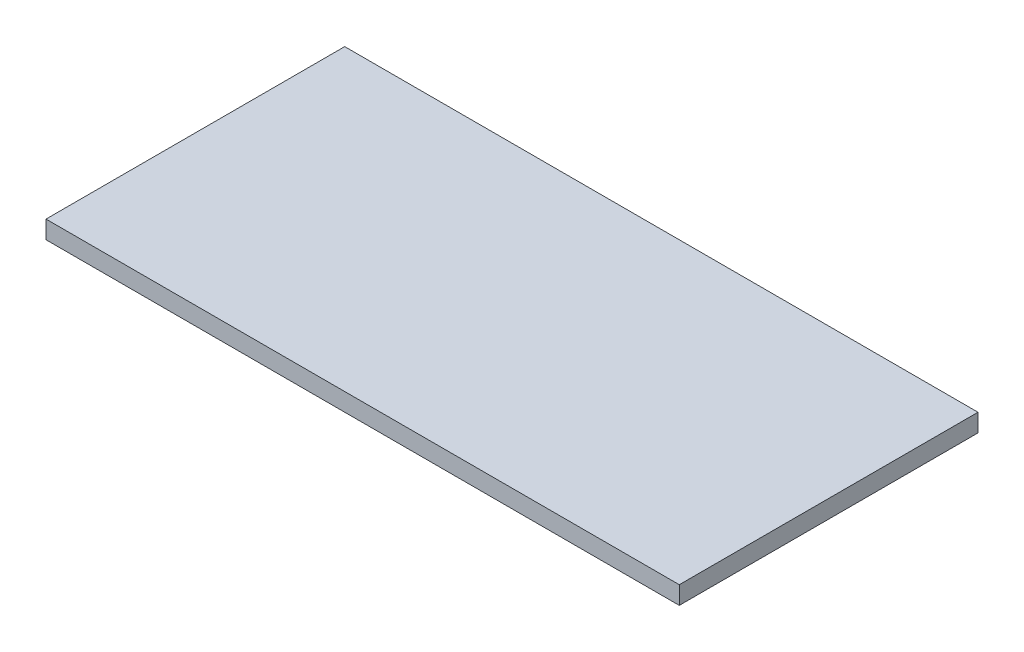
ISO-10303-21;
HEADER;
FILE_DESCRIPTION(('STEP AP214'),'2;1');
FILE_NAME('part.step','',(''),(''),'','','');
FILE_SCHEMA(('AUTOMOTIVE_DESIGN { 1 0 10303 214 1 1 1 1 }'));
ENDSEC;
DATA;
#1=APPLICATION_CONTEXT('core data for automotive mechanical design processes');
#2=APPLICATION_PROTOCOL_DEFINITION('international standard','automotive_design',2000,#1);
#3=PRODUCT_CONTEXT('',#1,'mechanical');
#4=PRODUCT('Part','Part','',(#3));
#5=PRODUCT_RELATED_PRODUCT_CATEGORY('part','',(#4));
#6=PRODUCT_DEFINITION_FORMATION('','',#4);
#7=PRODUCT_DEFINITION_CONTEXT('part definition',#1,'design');
#8=PRODUCT_DEFINITION('design','',#6,#7);
#9=PRODUCT_DEFINITION_SHAPE('','',#8);
#10=(LENGTH_UNIT() NAMED_UNIT(*) SI_UNIT(.MILLI.,.METRE.));
#11=(NAMED_UNIT(*) PLANE_ANGLE_UNIT() SI_UNIT($,.RADIAN.));
#12=(NAMED_UNIT(*) SI_UNIT($,.STERADIAN.) SOLID_ANGLE_UNIT());
#13=UNCERTAINTY_MEASURE_WITH_UNIT(LENGTH_MEASURE(1.E-05),#10,'distance_accuracy_value','');
#14=(GEOMETRIC_REPRESENTATION_CONTEXT(3) GLOBAL_UNCERTAINTY_ASSIGNED_CONTEXT((#13)) GLOBAL_UNIT_ASSIGNED_CONTEXT((#10,
#11,#12)) REPRESENTATION_CONTEXT('',''));
#15=CARTESIAN_POINT('',(0.,0.,0.));
#16=DIRECTION('',(0.,0.,1.));
#17=DIRECTION('',(1.,0.,0.));
#18=AXIS2_PLACEMENT_3D('',#15,#16,#17);
#19=CARTESIAN_POINT('',(0.,6.,0.));
#20=DIRECTION('',(1.,0.,0.));
#21=DIRECTION('',(0.,0.,-1.));
#22=AXIS2_PLACEMENT_3D('',#19,#20,#21);
#23=PLANE('',#22);
#24=DIRECTION('',(0.,0.,1.));
#25=VECTOR('',#24,1.);
#26=CARTESIAN_POINT('',(0.,0.,0.));
#27=LINE('',#26,#25);
#28=CARTESIAN_POINT('',(0.,0.,-100.));
#29=VERTEX_POINT('',#28);
#30=CARTESIAN_POINT('',(0.,0.,0.));
#31=VERTEX_POINT('',#30);
#32=EDGE_CURVE('E96',#29,#31,#27,.T.);
#33=ORIENTED_EDGE('',*,*,#32,.T.);
#34=DIRECTION('',(0.,-1.,0.));
#35=VECTOR('',#34,1.);
#36=CARTESIAN_POINT('',(0.,6.,0.));
#37=LINE('',#36,#35);
#38=CARTESIAN_POINT('',(0.,6.,0.));
#39=VERTEX_POINT('',#38);
#40=EDGE_CURVE('E11',#39,#31,#37,.T.);
#41=ORIENTED_EDGE('',*,*,#40,.F.);
#42=DIRECTION('',(0.,0.,1.));
#43=VECTOR('',#42,1.);
#44=CARTESIAN_POINT('',(0.,6.,0.));
#45=LINE('',#44,#43);
#46=CARTESIAN_POINT('',(0.,6.,-100.));
#47=VERTEX_POINT('',#46);
#48=EDGE_CURVE('E84',#47,#39,#45,.T.);
#49=ORIENTED_EDGE('',*,*,#48,.F.);
#50=DIRECTION('',(0.,-1.,0.));
#51=VECTOR('',#50,1.);
#52=CARTESIAN_POINT('',(0.,6.,-100.));
#53=LINE('',#52,#51);
#54=EDGE_CURVE('E92',#47,#29,#53,.T.);
#55=ORIENTED_EDGE('',*,*,#54,.T.);
#56=EDGE_LOOP('',(#33,#41,#49,#55));
#57=FACE_BOUND('',#56,.T.);
#58=ADVANCED_FACE('F33',(#57),#23,.F.);
#59=CARTESIAN_POINT('',(0.,6.,0.));
#60=DIRECTION('',(0.,0.,-1.));
#61=DIRECTION('',(-1.,0.,0.));
#62=AXIS2_PLACEMENT_3D('',#59,#60,#61);
#63=PLANE('',#62);
#64=DIRECTION('',(1.,0.,0.));
#65=VECTOR('',#64,1.);
#66=CARTESIAN_POINT('',(0.,0.,0.));
#67=LINE('',#66,#65);
#68=CARTESIAN_POINT('',(212.,0.,0.));
#69=VERTEX_POINT('',#68);
#70=EDGE_CURVE('E88',#31,#69,#67,.T.);
#71=ORIENTED_EDGE('',*,*,#70,.T.);
#72=DIRECTION('',(0.,-1.,0.));
#73=VECTOR('',#72,1.);
#74=CARTESIAN_POINT('',(212.,6.,0.));
#75=LINE('',#74,#73);
#76=CARTESIAN_POINT('',(212.,6.,0.));
#77=VERTEX_POINT('',#76);
#78=EDGE_CURVE('E41',#77,#69,#75,.T.);
#79=ORIENTED_EDGE('',*,*,#78,.F.);
#80=DIRECTION('',(1.,0.,0.));
#81=VECTOR('',#80,1.);
#82=CARTESIAN_POINT('',(0.,6.,0.));
#83=LINE('',#82,#81);
#84=EDGE_CURVE('E79',#39,#77,#83,.T.);
#85=ORIENTED_EDGE('',*,*,#84,.F.);
#86=ORIENTED_EDGE('',*,*,#40,.T.);
#87=EDGE_LOOP('',(#71,#79,#85,#86));
#88=FACE_BOUND('',#87,.T.);
#89=ADVANCED_FACE('F87',(#88),#63,.F.);
#90=CARTESIAN_POINT('',(212.,6.,0.));
#91=DIRECTION('',(-1.,0.,0.));
#92=DIRECTION('',(0.,0.,1.));
#93=AXIS2_PLACEMENT_3D('',#90,#91,#92);
#94=PLANE('',#93);
#95=DIRECTION('',(0.,0.,-1.));
#96=VECTOR('',#95,1.);
#97=CARTESIAN_POINT('',(212.,0.,0.));
#98=LINE('',#97,#96);
#99=CARTESIAN_POINT('',(212.,0.,-100.));
#100=VERTEX_POINT('',#99);
#101=EDGE_CURVE('E66',#69,#100,#98,.T.);
#102=ORIENTED_EDGE('',*,*,#101,.T.);
#103=DIRECTION('',(0.,-1.,0.));
#104=VECTOR('',#103,1.);
#105=CARTESIAN_POINT('',(212.,6.,-100.));
#106=LINE('',#105,#104);
#107=CARTESIAN_POINT('',(212.,6.,-100.));
#108=VERTEX_POINT('',#107);
#109=EDGE_CURVE('E89',#108,#100,#106,.T.);
#110=ORIENTED_EDGE('',*,*,#109,.F.);
#111=DIRECTION('',(0.,0.,-1.));
#112=VECTOR('',#111,1.);
#113=CARTESIAN_POINT('',(212.,6.,0.));
#114=LINE('',#113,#112);
#115=EDGE_CURVE('E82',#77,#108,#114,.T.);
#116=ORIENTED_EDGE('',*,*,#115,.F.);
#117=ORIENTED_EDGE('',*,*,#78,.T.);
#118=EDGE_LOOP('',(#102,#110,#116,#117));
#119=FACE_BOUND('',#118,.T.);
#120=ADVANCED_FACE('F90',(#119),#94,.F.);
#121=CARTESIAN_POINT('',(0.,6.,-100.));
#122=DIRECTION('',(0.,0.,1.));
#123=DIRECTION('',(1.,0.,0.));
#124=AXIS2_PLACEMENT_3D('',#121,#122,#123);
#125=PLANE('',#124);
#126=DIRECTION('',(-1.,0.,0.));
#127=VECTOR('',#126,1.);
#128=CARTESIAN_POINT('',(0.,0.,-100.));
#129=LINE('',#128,#127);
#130=EDGE_CURVE('E72',#100,#29,#129,.T.);
#131=ORIENTED_EDGE('',*,*,#130,.T.);
#132=ORIENTED_EDGE('',*,*,#54,.F.);
#133=DIRECTION('',(-1.,0.,0.));
#134=VECTOR('',#133,1.);
#135=CARTESIAN_POINT('',(0.,6.,-100.));
#136=LINE('',#135,#134);
#137=EDGE_CURVE('E49',#108,#47,#136,.T.);
#138=ORIENTED_EDGE('',*,*,#137,.F.);
#139=ORIENTED_EDGE('',*,*,#109,.T.);
#140=EDGE_LOOP('',(#131,#132,#138,#139));
#141=FACE_BOUND('',#140,.T.);
#142=ADVANCED_FACE('F103',(#141),#125,.F.);
#143=CARTESIAN_POINT('',(0.,6.,0.));
#144=DIRECTION('',(0.,-1.,0.));
#145=DIRECTION('',(0.,0.,-1.));
#146=AXIS2_PLACEMENT_3D('',#143,#144,#145);
#147=PLANE('',#146);
#148=ORIENTED_EDGE('',*,*,#48,.T.);
#149=ORIENTED_EDGE('',*,*,#84,.T.);
#150=ORIENTED_EDGE('',*,*,#115,.T.);
#151=ORIENTED_EDGE('',*,*,#137,.T.);
#152=EDGE_LOOP('',(#148,#149,#150,#151));
#153=FACE_BOUND('',#152,.T.);
#154=ADVANCED_FACE('F80',(#153),#147,.F.);
#155=CARTESIAN_POINT('',(0.,0.,0.));
#156=DIRECTION('',(0.,-1.,0.));
#157=DIRECTION('',(0.,0.,-1.));
#158=AXIS2_PLACEMENT_3D('',#155,#156,#157);
#159=PLANE('',#158);
#160=ORIENTED_EDGE('',*,*,#32,.F.);
#161=ORIENTED_EDGE('',*,*,#130,.F.);
#162=ORIENTED_EDGE('',*,*,#101,.F.);
#163=ORIENTED_EDGE('',*,*,#70,.F.);
#164=EDGE_LOOP('',(#160,#161,#162,#163));
#165=FACE_BOUND('',#164,.T.);
#166=ADVANCED_FACE('F106',(#165),#159,.T.);
#167=CLOSED_SHELL('',(#58,#89,#120,#142,#154,#166));
#168=MANIFOLD_SOLID_BREP('B2',#167);
#169=ADVANCED_BREP_SHAPE_REPRESENTATION('',(#18,#168),#14);
#170=SHAPE_DEFINITION_REPRESENTATION(#9,#169);
ENDSEC;
END-ISO-10303-21;
